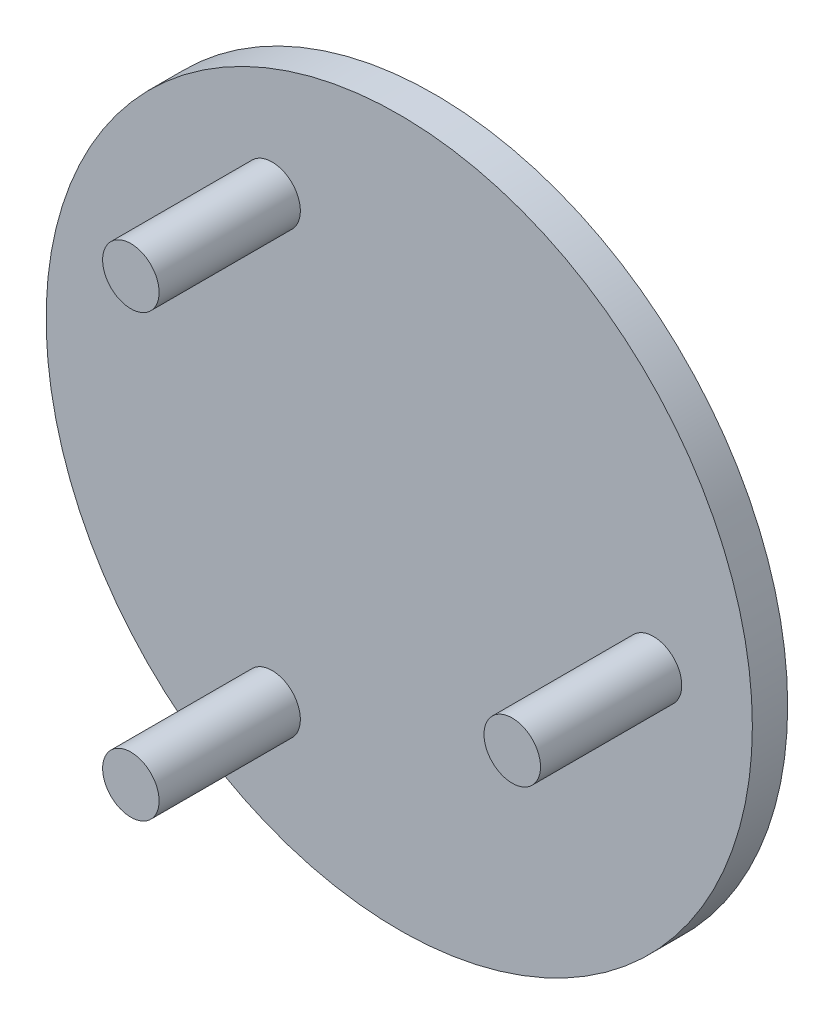
ISO-10303-21;
HEADER;
FILE_DESCRIPTION(('STEP AP214'),'2;1');
FILE_NAME('part.step','',(''),(''),'','','');
FILE_SCHEMA(('AUTOMOTIVE_DESIGN { 1 0 10303 214 1 1 1 1 }'));
ENDSEC;
DATA;
#1=APPLICATION_CONTEXT('core data for automotive mechanical design processes');
#2=APPLICATION_PROTOCOL_DEFINITION('international standard','automotive_design',2000,#1);
#3=PRODUCT_CONTEXT('',#1,'mechanical');
#4=PRODUCT('Part','Part','',(#3));
#5=PRODUCT_RELATED_PRODUCT_CATEGORY('part','',(#4));
#6=PRODUCT_DEFINITION_FORMATION('','',#4);
#7=PRODUCT_DEFINITION_CONTEXT('part definition',#1,'design');
#8=PRODUCT_DEFINITION('design','',#6,#7);
#9=PRODUCT_DEFINITION_SHAPE('','',#8);
#10=(LENGTH_UNIT() NAMED_UNIT(*) SI_UNIT(.MILLI.,.METRE.));
#11=(NAMED_UNIT(*) PLANE_ANGLE_UNIT() SI_UNIT($,.RADIAN.));
#12=(NAMED_UNIT(*) SI_UNIT($,.STERADIAN.) SOLID_ANGLE_UNIT());
#13=UNCERTAINTY_MEASURE_WITH_UNIT(LENGTH_MEASURE(1.E-05),#10,'distance_accuracy_value','');
#14=(GEOMETRIC_REPRESENTATION_CONTEXT(3) GLOBAL_UNCERTAINTY_ASSIGNED_CONTEXT((#13)) GLOBAL_UNIT_ASSIGNED_CONTEXT((#10,
#11,#12)) REPRESENTATION_CONTEXT('',''));
#15=CARTESIAN_POINT('',(0.,0.,0.));
#16=DIRECTION('',(0.,0.,1.));
#17=DIRECTION('',(1.,0.,0.));
#18=AXIS2_PLACEMENT_3D('',#15,#16,#17);
#19=CARTESIAN_POINT('',(0.,0.,-5.));
#20=DIRECTION('',(0.,0.,1.));
#21=DIRECTION('',(1.,0.,0.));
#22=AXIS2_PLACEMENT_3D('',#19,#20,#21);
#23=CYLINDRICAL_SURFACE('',#22,50.);
#24=CARTESIAN_POINT('',(0.,0.,-5.));
#25=DIRECTION('',(0.,0.,1.));
#26=DIRECTION('',(1.,0.,0.));
#27=AXIS2_PLACEMENT_3D('',#24,#25,#26);
#28=CIRCLE('',#27,50.);
#29=CARTESIAN_POINT('',(50.,0.,-5.));
#30=VERTEX_POINT('',#29);
#31=EDGE_CURVE('E58',#30,#30,#28,.T.);
#32=ORIENTED_EDGE('',*,*,#31,.T.);
#33=EDGE_LOOP('',(#32));
#34=FACE_BOUND('',#33,.T.);
#35=CARTESIAN_POINT('',(0.,0.,0.));
#36=DIRECTION('',(0.,0.,1.));
#37=DIRECTION('',(1.,0.,0.));
#38=AXIS2_PLACEMENT_3D('',#35,#36,#37);
#39=CIRCLE('',#38,50.);
#40=CARTESIAN_POINT('',(50.,0.,0.));
#41=VERTEX_POINT('',#40);
#42=EDGE_CURVE('E37',#41,#41,#39,.T.);
#43=ORIENTED_EDGE('',*,*,#42,.F.);
#44=EDGE_LOOP('',(#43));
#45=FACE_BOUND('',#44,.T.);
#46=ADVANCED_FACE('F40',(#34,#45),#23,.T.);
#47=CARTESIAN_POINT('',(0.,0.,-5.));
#48=DIRECTION('',(0.,0.,1.));
#49=DIRECTION('',(1.,0.,0.));
#50=AXIS2_PLACEMENT_3D('',#47,#48,#49);
#51=PLANE('',#50);
#52=ORIENTED_EDGE('',*,*,#31,.F.);
#53=EDGE_LOOP('',(#52));
#54=FACE_BOUND('',#53,.T.);
#55=ADVANCED_FACE('F87',(#54),#51,.F.);
#56=CARTESIAN_POINT('',(0.,0.,0.));
#57=DIRECTION('',(0.,0.,1.));
#58=DIRECTION('',(1.,0.,0.));
#59=AXIS2_PLACEMENT_3D('',#56,#57,#58);
#60=PLANE('',#59);
#61=CARTESIAN_POINT('',(36.,0.,0.));
#62=DIRECTION('',(0.,0.,1.));
#63=DIRECTION('',(1.,0.,0.));
#64=AXIS2_PLACEMENT_3D('',#61,#62,#63);
#65=CIRCLE('',#64,4.);
#66=CARTESIAN_POINT('',(40.,0.,0.));
#67=VERTEX_POINT('',#66);
#68=EDGE_CURVE('E10',#67,#67,#65,.T.);
#69=ORIENTED_EDGE('',*,*,#68,.F.);
#70=EDGE_LOOP('',(#69));
#71=FACE_BOUND('',#70,.T.);
#72=CARTESIAN_POINT('',(-18.,31.1769145362398,0.));
#73=DIRECTION('',(0.,0.,1.));
#74=DIRECTION('',(1.,0.,0.));
#75=AXIS2_PLACEMENT_3D('',#72,#73,#74);
#76=CIRCLE('',#75,4.);
#77=CARTESIAN_POINT('',(-14.,31.1769145362398,0.));
#78=VERTEX_POINT('',#77);
#79=EDGE_CURVE('E42',#78,#78,#76,.T.);
#80=ORIENTED_EDGE('',*,*,#79,.F.);
#81=EDGE_LOOP('',(#80));
#82=FACE_BOUND('',#81,.T.);
#83=CARTESIAN_POINT('',(-18.,-31.1769145362398,0.));
#84=DIRECTION('',(0.,0.,1.));
#85=DIRECTION('',(1.,0.,0.));
#86=AXIS2_PLACEMENT_3D('',#83,#84,#85);
#87=CIRCLE('',#86,3.99999999999998);
#88=CARTESIAN_POINT('',(-14.,-31.1769145362398,0.));
#89=VERTEX_POINT('',#88);
#90=EDGE_CURVE('E47',#89,#89,#87,.T.);
#91=ORIENTED_EDGE('',*,*,#90,.F.);
#92=EDGE_LOOP('',(#91));
#93=FACE_BOUND('',#92,.T.);
#94=ORIENTED_EDGE('',*,*,#42,.T.);
#95=EDGE_LOOP('',(#94));
#96=FACE_BOUND('',#95,.T.);
#97=ADVANCED_FACE('F93',(#71,#82,#93,#96),#60,.T.);
#98=CARTESIAN_POINT('',(-18.,-31.1769145362398,20.));
#99=DIRECTION('',(0.,0.,-1.));
#100=DIRECTION('',(-1.,0.,0.));
#101=AXIS2_PLACEMENT_3D('',#98,#99,#100);
#102=CYLINDRICAL_SURFACE('',#101,3.99999999999998);
#103=CARTESIAN_POINT('',(-18.,-31.1769145362398,20.));
#104=DIRECTION('',(0.,0.,1.));
#105=DIRECTION('',(1.,0.,0.));
#106=AXIS2_PLACEMENT_3D('',#103,#104,#105);
#107=CIRCLE('',#106,3.99999999999998);
#108=CARTESIAN_POINT('',(-14.,-31.1769145362398,20.));
#109=VERTEX_POINT('',#108);
#110=EDGE_CURVE('E60',#109,#109,#107,.T.);
#111=ORIENTED_EDGE('',*,*,#110,.F.);
#112=EDGE_LOOP('',(#111));
#113=FACE_BOUND('',#112,.T.);
#114=ORIENTED_EDGE('',*,*,#90,.T.);
#115=EDGE_LOOP('',(#114));
#116=FACE_BOUND('',#115,.T.);
#117=ADVANCED_FACE('F98',(#113,#116),#102,.T.);
#118=CARTESIAN_POINT('',(-18.,-31.1769145362398,20.));
#119=DIRECTION('',(0.,0.,1.));
#120=DIRECTION('',(1.,0.,0.));
#121=AXIS2_PLACEMENT_3D('',#118,#119,#120);
#122=PLANE('',#121);
#123=ORIENTED_EDGE('',*,*,#110,.T.);
#124=EDGE_LOOP('',(#123));
#125=FACE_BOUND('',#124,.T.);
#126=ADVANCED_FACE('F101',(#125),#122,.T.);
#127=CARTESIAN_POINT('',(-18.,31.1769145362398,20.));
#128=DIRECTION('',(0.,0.,-1.));
#129=DIRECTION('',(-1.,0.,0.));
#130=AXIS2_PLACEMENT_3D('',#127,#128,#129);
#131=CYLINDRICAL_SURFACE('',#130,4.);
#132=CARTESIAN_POINT('',(-18.,31.1769145362398,20.));
#133=DIRECTION('',(0.,0.,1.));
#134=DIRECTION('',(1.,0.,0.));
#135=AXIS2_PLACEMENT_3D('',#132,#133,#134);
#136=CIRCLE('',#135,4.);
#137=CARTESIAN_POINT('',(-14.,31.1769145362398,20.));
#138=VERTEX_POINT('',#137);
#139=EDGE_CURVE('E53',#138,#138,#136,.T.);
#140=ORIENTED_EDGE('',*,*,#139,.F.);
#141=EDGE_LOOP('',(#140));
#142=FACE_BOUND('',#141,.T.);
#143=ORIENTED_EDGE('',*,*,#79,.T.);
#144=EDGE_LOOP('',(#143));
#145=FACE_BOUND('',#144,.T.);
#146=ADVANCED_FACE('F85',(#142,#145),#131,.T.);
#147=CARTESIAN_POINT('',(-18.,31.1769145362398,20.));
#148=DIRECTION('',(0.,0.,1.));
#149=DIRECTION('',(1.,0.,0.));
#150=AXIS2_PLACEMENT_3D('',#147,#148,#149);
#151=PLANE('',#150);
#152=ORIENTED_EDGE('',*,*,#139,.T.);
#153=EDGE_LOOP('',(#152));
#154=FACE_BOUND('',#153,.T.);
#155=ADVANCED_FACE('F73',(#154),#151,.T.);
#156=CARTESIAN_POINT('',(36.,0.,20.));
#157=DIRECTION('',(0.,0.,-1.));
#158=DIRECTION('',(-1.,0.,0.));
#159=AXIS2_PLACEMENT_3D('',#156,#157,#158);
#160=CYLINDRICAL_SURFACE('',#159,4.);
#161=CARTESIAN_POINT('',(36.,0.,20.));
#162=DIRECTION('',(0.,0.,1.));
#163=DIRECTION('',(1.,0.,0.));
#164=AXIS2_PLACEMENT_3D('',#161,#162,#163);
#165=CIRCLE('',#164,4.);
#166=CARTESIAN_POINT('',(40.,0.,20.));
#167=VERTEX_POINT('',#166);
#168=EDGE_CURVE('E55',#167,#167,#165,.T.);
#169=ORIENTED_EDGE('',*,*,#168,.F.);
#170=EDGE_LOOP('',(#169));
#171=FACE_BOUND('',#170,.T.);
#172=ORIENTED_EDGE('',*,*,#68,.T.);
#173=EDGE_LOOP('',(#172));
#174=FACE_BOUND('',#173,.T.);
#175=ADVANCED_FACE('F71',(#171,#174),#160,.T.);
#176=CARTESIAN_POINT('',(36.,0.,20.));
#177=DIRECTION('',(0.,0.,1.));
#178=DIRECTION('',(1.,0.,0.));
#179=AXIS2_PLACEMENT_3D('',#176,#177,#178);
#180=PLANE('',#179);
#181=ORIENTED_EDGE('',*,*,#168,.T.);
#182=EDGE_LOOP('',(#181));
#183=FACE_BOUND('',#182,.T.);
#184=ADVANCED_FACE('F72',(#183),#180,.T.);
#185=CLOSED_SHELL('',(#46,#55,#97,#117,#126,#146,#155,#175,#184));
#186=MANIFOLD_SOLID_BREP('B2',#185);
#187=ADVANCED_BREP_SHAPE_REPRESENTATION('',(#18,#186),#14);
#188=SHAPE_DEFINITION_REPRESENTATION(#9,#187);
ENDSEC;
END-ISO-10303-21;
